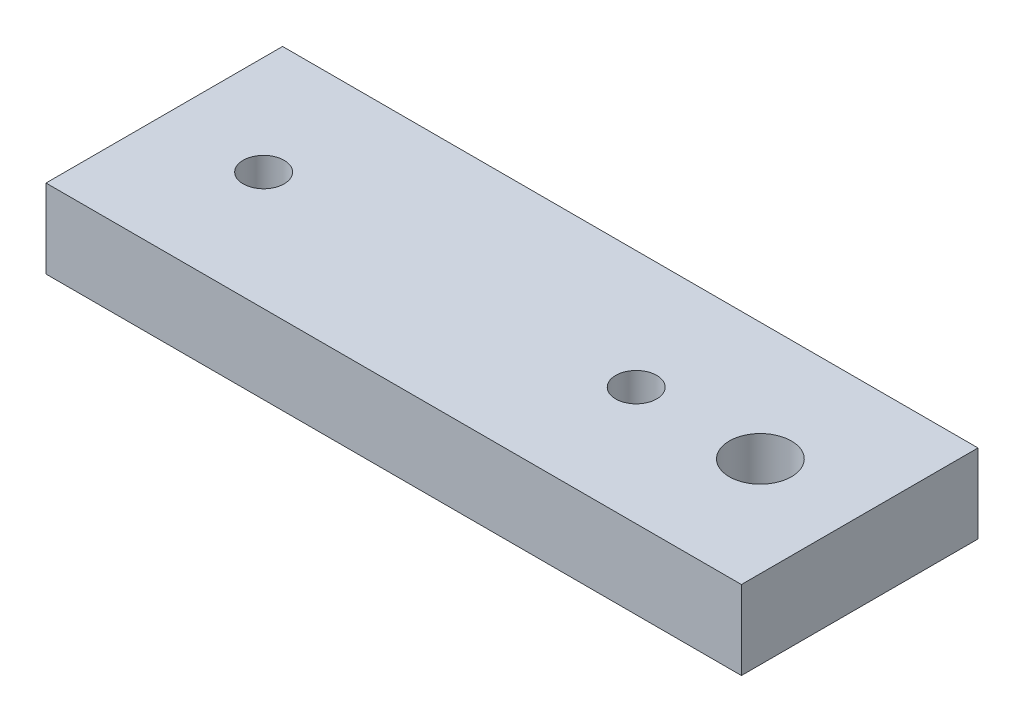
ISO-10303-21;
HEADER;
FILE_DESCRIPTION(('STEP AP214'),'2;1');
FILE_NAME('part.step','',(''),(''),'','','');
FILE_SCHEMA(('AUTOMOTIVE_DESIGN { 1 0 10303 214 1 1 1 1 }'));
ENDSEC;
DATA;
#1=APPLICATION_CONTEXT('core data for automotive mechanical design processes');
#2=APPLICATION_PROTOCOL_DEFINITION('international standard','automotive_design',2000,#1);
#3=PRODUCT_CONTEXT('',#1,'mechanical');
#4=PRODUCT('Part','Part','',(#3));
#5=PRODUCT_RELATED_PRODUCT_CATEGORY('part','',(#4));
#6=PRODUCT_DEFINITION_FORMATION('','',#4);
#7=PRODUCT_DEFINITION_CONTEXT('part definition',#1,'design');
#8=PRODUCT_DEFINITION('design','',#6,#7);
#9=PRODUCT_DEFINITION_SHAPE('','',#8);
#10=(LENGTH_UNIT() NAMED_UNIT(*) SI_UNIT(.MILLI.,.METRE.));
#11=(NAMED_UNIT(*) PLANE_ANGLE_UNIT() SI_UNIT($,.RADIAN.));
#12=(NAMED_UNIT(*) SI_UNIT($,.STERADIAN.) SOLID_ANGLE_UNIT());
#13=UNCERTAINTY_MEASURE_WITH_UNIT(LENGTH_MEASURE(1.E-05),#10,'distance_accuracy_value','');
#14=(GEOMETRIC_REPRESENTATION_CONTEXT(3) GLOBAL_UNCERTAINTY_ASSIGNED_CONTEXT((#13)) GLOBAL_UNIT_ASSIGNED_CONTEXT((#10,
#11,#12)) REPRESENTATION_CONTEXT('',''));
#15=CARTESIAN_POINT('',(0.,0.,0.));
#16=DIRECTION('',(0.,0.,1.));
#17=DIRECTION('',(1.,0.,0.));
#18=AXIS2_PLACEMENT_3D('',#15,#16,#17);
#19=CARTESIAN_POINT('',(-28.,6.35,9.525));
#20=DIRECTION('',(1.,0.,0.));
#21=DIRECTION('',(0.,0.,-1.));
#22=AXIS2_PLACEMENT_3D('',#19,#20,#21);
#23=PLANE('',#22);
#24=DIRECTION('',(0.,0.,1.));
#25=VECTOR('',#24,1.);
#26=CARTESIAN_POINT('',(-28.,0.,9.525));
#27=LINE('',#26,#25);
#28=CARTESIAN_POINT('',(-28.,0.,-9.525));
#29=VERTEX_POINT('',#28);
#30=CARTESIAN_POINT('',(-28.,0.,9.525));
#31=VERTEX_POINT('',#30);
#32=EDGE_CURVE('E98',#29,#31,#27,.T.);
#33=ORIENTED_EDGE('',*,*,#32,.T.);
#34=DIRECTION('',(0.,-1.,0.));
#35=VECTOR('',#34,1.);
#36=CARTESIAN_POINT('',(-28.,6.35,9.525));
#37=LINE('',#36,#35);
#38=CARTESIAN_POINT('',(-28.,6.35,9.525));
#39=VERTEX_POINT('',#38);
#40=EDGE_CURVE('E11',#39,#31,#37,.T.);
#41=ORIENTED_EDGE('',*,*,#40,.F.);
#42=DIRECTION('',(0.,0.,1.));
#43=VECTOR('',#42,1.);
#44=CARTESIAN_POINT('',(-28.,6.35,9.525));
#45=LINE('',#44,#43);
#46=CARTESIAN_POINT('',(-28.,6.35,-9.525));
#47=VERTEX_POINT('',#46);
#48=EDGE_CURVE('E86',#47,#39,#45,.T.);
#49=ORIENTED_EDGE('',*,*,#48,.F.);
#50=DIRECTION('',(0.,-1.,0.));
#51=VECTOR('',#50,1.);
#52=CARTESIAN_POINT('',(-28.,6.35,-9.525));
#53=LINE('',#52,#51);
#54=EDGE_CURVE('E94',#47,#29,#53,.T.);
#55=ORIENTED_EDGE('',*,*,#54,.T.);
#56=EDGE_LOOP('',(#33,#41,#49,#55));
#57=FACE_BOUND('',#56,.T.);
#58=ADVANCED_FACE('F35',(#57),#23,.F.);
#59=CARTESIAN_POINT('',(28.,6.35,9.525));
#60=DIRECTION('',(0.,0.,-1.));
#61=DIRECTION('',(-1.,0.,0.));
#62=AXIS2_PLACEMENT_3D('',#59,#60,#61);
#63=PLANE('',#62);
#64=DIRECTION('',(1.,0.,0.));
#65=VECTOR('',#64,1.);
#66=CARTESIAN_POINT('',(28.,0.,9.525));
#67=LINE('',#66,#65);
#68=CARTESIAN_POINT('',(28.,0.,9.525));
#69=VERTEX_POINT('',#68);
#70=EDGE_CURVE('E90',#31,#69,#67,.T.);
#71=ORIENTED_EDGE('',*,*,#70,.T.);
#72=DIRECTION('',(0.,-1.,0.));
#73=VECTOR('',#72,1.);
#74=CARTESIAN_POINT('',(28.,6.35,9.525));
#75=LINE('',#74,#73);
#76=CARTESIAN_POINT('',(28.,6.35,9.525));
#77=VERTEX_POINT('',#76);
#78=EDGE_CURVE('E43',#77,#69,#75,.T.);
#79=ORIENTED_EDGE('',*,*,#78,.F.);
#80=DIRECTION('',(1.,0.,0.));
#81=VECTOR('',#80,1.);
#82=CARTESIAN_POINT('',(28.,6.35,9.525));
#83=LINE('',#82,#81);
#84=EDGE_CURVE('E81',#39,#77,#83,.T.);
#85=ORIENTED_EDGE('',*,*,#84,.F.);
#86=ORIENTED_EDGE('',*,*,#40,.T.);
#87=EDGE_LOOP('',(#71,#79,#85,#86));
#88=FACE_BOUND('',#87,.T.);
#89=ADVANCED_FACE('F89',(#88),#63,.F.);
#90=CARTESIAN_POINT('',(28.,6.35,9.525));
#91=DIRECTION('',(-1.,0.,0.));
#92=DIRECTION('',(0.,0.,1.));
#93=AXIS2_PLACEMENT_3D('',#90,#91,#92);
#94=PLANE('',#93);
#95=DIRECTION('',(0.,0.,-1.));
#96=VECTOR('',#95,1.);
#97=CARTESIAN_POINT('',(28.,0.,9.525));
#98=LINE('',#97,#96);
#99=CARTESIAN_POINT('',(28.,0.,-9.52500000000001));
#100=VERTEX_POINT('',#99);
#101=EDGE_CURVE('E68',#69,#100,#98,.T.);
#102=ORIENTED_EDGE('',*,*,#101,.T.);
#103=DIRECTION('',(0.,-1.,0.));
#104=VECTOR('',#103,1.);
#105=CARTESIAN_POINT('',(28.,6.35,-9.52500000000001));
#106=LINE('',#105,#104);
#107=CARTESIAN_POINT('',(28.,6.35,-9.52500000000001));
#108=VERTEX_POINT('',#107);
#109=EDGE_CURVE('E91',#108,#100,#106,.T.);
#110=ORIENTED_EDGE('',*,*,#109,.F.);
#111=DIRECTION('',(0.,0.,-1.));
#112=VECTOR('',#111,1.);
#113=CARTESIAN_POINT('',(28.,6.35,9.525));
#114=LINE('',#113,#112);
#115=EDGE_CURVE('E84',#77,#108,#114,.T.);
#116=ORIENTED_EDGE('',*,*,#115,.F.);
#117=ORIENTED_EDGE('',*,*,#78,.T.);
#118=EDGE_LOOP('',(#102,#110,#116,#117));
#119=FACE_BOUND('',#118,.T.);
#120=ADVANCED_FACE('F92',(#119),#94,.F.);
#121=CARTESIAN_POINT('',(28.,6.35,-9.52500000000001));
#122=DIRECTION('',(0.,0.,1.));
#123=DIRECTION('',(1.,0.,0.));
#124=AXIS2_PLACEMENT_3D('',#121,#122,#123);
#125=PLANE('',#124);
#126=DIRECTION('',(-1.,0.,0.));
#127=VECTOR('',#126,1.);
#128=CARTESIAN_POINT('',(28.,0.,-9.52500000000001));
#129=LINE('',#128,#127);
#130=EDGE_CURVE('E74',#100,#29,#129,.T.);
#131=ORIENTED_EDGE('',*,*,#130,.T.);
#132=ORIENTED_EDGE('',*,*,#54,.F.);
#133=DIRECTION('',(-1.,0.,0.));
#134=VECTOR('',#133,1.);
#135=CARTESIAN_POINT('',(28.,6.35,-9.52500000000001));
#136=LINE('',#135,#134);
#137=EDGE_CURVE('E51',#108,#47,#136,.T.);
#138=ORIENTED_EDGE('',*,*,#137,.F.);
#139=ORIENTED_EDGE('',*,*,#109,.T.);
#140=EDGE_LOOP('',(#131,#132,#138,#139));
#141=FACE_BOUND('',#140,.T.);
#142=ADVANCED_FACE('F106',(#141),#125,.F.);
#143=CARTESIAN_POINT('',(0.,6.35,0.));
#144=DIRECTION('',(0.,1.,0.));
#145=DIRECTION('',(0.,0.,1.));
#146=AXIS2_PLACEMENT_3D('',#143,#144,#145);
#147=PLANE('',#146);
#148=CARTESIAN_POINT('',(-20.,6.35,0.));
#149=DIRECTION('',(0.,1.,0.));
#150=DIRECTION('',(0.,0.,1.));
#151=AXIS2_PLACEMENT_3D('',#148,#149,#150);
#152=CIRCLE('',#151,1.65);
#153=CARTESIAN_POINT('',(-20.,6.35,1.65));
#154=VERTEX_POINT('',#153);
#155=EDGE_CURVE('E126',#154,#154,#152,.T.);
#156=ORIENTED_EDGE('',*,*,#155,.F.);
#157=EDGE_LOOP('',(#156));
#158=FACE_BOUND('',#157,.T.);
#159=CARTESIAN_POINT('',(10.,6.35,0.));
#160=DIRECTION('',(0.,1.,0.));
#161=DIRECTION('',(0.,0.,1.));
#162=AXIS2_PLACEMENT_3D('',#159,#160,#161);
#163=CIRCLE('',#162,1.65);
#164=CARTESIAN_POINT('',(10.,6.35,1.65));
#165=VERTEX_POINT('',#164);
#166=EDGE_CURVE('E120',#165,#165,#163,.T.);
#167=ORIENTED_EDGE('',*,*,#166,.F.);
#168=EDGE_LOOP('',(#167));
#169=FACE_BOUND('',#168,.T.);
#170=CARTESIAN_POINT('',(20.,6.35,0.));
#171=DIRECTION('',(0.,1.,0.));
#172=DIRECTION('',(0.,0.,1.));
#173=AXIS2_PLACEMENT_3D('',#170,#171,#172);
#174=CIRCLE('',#173,2.5);
#175=CARTESIAN_POINT('',(20.,6.35,2.5));
#176=VERTEX_POINT('',#175);
#177=EDGE_CURVE('E114',#176,#176,#174,.T.);
#178=ORIENTED_EDGE('',*,*,#177,.F.);
#179=EDGE_LOOP('',(#178));
#180=FACE_BOUND('',#179,.T.);
#181=ORIENTED_EDGE('',*,*,#48,.T.);
#182=ORIENTED_EDGE('',*,*,#84,.T.);
#183=ORIENTED_EDGE('',*,*,#115,.T.);
#184=ORIENTED_EDGE('',*,*,#137,.T.);
#185=EDGE_LOOP('',(#181,#182,#183,#184));
#186=FACE_BOUND('',#185,.T.);
#187=ADVANCED_FACE('F82',(#158,#169,#180,#186),#147,.T.);
#188=CARTESIAN_POINT('',(0.,0.,0.));
#189=DIRECTION('',(0.,1.,0.));
#190=DIRECTION('',(0.,0.,1.));
#191=AXIS2_PLACEMENT_3D('',#188,#189,#190);
#192=PLANE('',#191);
#193=CARTESIAN_POINT('',(-20.,0.,0.));
#194=DIRECTION('',(0.,1.,0.));
#195=DIRECTION('',(0.,0.,1.));
#196=AXIS2_PLACEMENT_3D('',#193,#194,#195);
#197=CIRCLE('',#196,1.65);
#198=CARTESIAN_POINT('',(-20.,0.,1.65));
#199=VERTEX_POINT('',#198);
#200=EDGE_CURVE('E123',#199,#199,#197,.T.);
#201=ORIENTED_EDGE('',*,*,#200,.T.);
#202=EDGE_LOOP('',(#201));
#203=FACE_BOUND('',#202,.T.);
#204=CARTESIAN_POINT('',(10.,0.,0.));
#205=DIRECTION('',(0.,1.,0.));
#206=DIRECTION('',(0.,0.,1.));
#207=AXIS2_PLACEMENT_3D('',#204,#205,#206);
#208=CIRCLE('',#207,1.65);
#209=CARTESIAN_POINT('',(10.,0.,1.65));
#210=VERTEX_POINT('',#209);
#211=EDGE_CURVE('E117',#210,#210,#208,.T.);
#212=ORIENTED_EDGE('',*,*,#211,.T.);
#213=EDGE_LOOP('',(#212));
#214=FACE_BOUND('',#213,.T.);
#215=CARTESIAN_POINT('',(20.,0.,0.));
#216=DIRECTION('',(0.,1.,0.));
#217=DIRECTION('',(0.,0.,1.));
#218=AXIS2_PLACEMENT_3D('',#215,#216,#217);
#219=CIRCLE('',#218,2.5);
#220=CARTESIAN_POINT('',(20.,0.,2.5));
#221=VERTEX_POINT('',#220);
#222=EDGE_CURVE('E101',#221,#221,#219,.T.);
#223=ORIENTED_EDGE('',*,*,#222,.T.);
#224=EDGE_LOOP('',(#223));
#225=FACE_BOUND('',#224,.T.);
#226=ORIENTED_EDGE('',*,*,#32,.F.);
#227=ORIENTED_EDGE('',*,*,#130,.F.);
#228=ORIENTED_EDGE('',*,*,#101,.F.);
#229=ORIENTED_EDGE('',*,*,#70,.F.);
#230=EDGE_LOOP('',(#226,#227,#228,#229));
#231=FACE_BOUND('',#230,.T.);
#232=ADVANCED_FACE('F109',(#203,#214,#225,#231),#192,.F.);
#233=CARTESIAN_POINT('',(20.,6.35,0.));
#234=DIRECTION('',(0.,1.,0.));
#235=DIRECTION('',(0.,0.,1.));
#236=AXIS2_PLACEMENT_3D('',#233,#234,#235);
#237=CYLINDRICAL_SURFACE('',#236,2.5);
#238=ORIENTED_EDGE('',*,*,#222,.F.);
#239=EDGE_LOOP('',(#238));
#240=FACE_BOUND('',#239,.T.);
#241=ORIENTED_EDGE('',*,*,#177,.T.);
#242=EDGE_LOOP('',(#241));
#243=FACE_BOUND('',#242,.T.);
#244=ADVANCED_FACE('F139',(#240,#243),#237,.F.);
#245=CARTESIAN_POINT('',(10.,6.35,0.));
#246=DIRECTION('',(0.,1.,0.));
#247=DIRECTION('',(0.,0.,1.));
#248=AXIS2_PLACEMENT_3D('',#245,#246,#247);
#249=CYLINDRICAL_SURFACE('',#248,1.65);
#250=ORIENTED_EDGE('',*,*,#211,.F.);
#251=EDGE_LOOP('',(#250));
#252=FACE_BOUND('',#251,.T.);
#253=ORIENTED_EDGE('',*,*,#166,.T.);
#254=EDGE_LOOP('',(#253));
#255=FACE_BOUND('',#254,.T.);
#256=ADVANCED_FACE('F141',(#252,#255),#249,.F.);
#257=CARTESIAN_POINT('',(-20.,6.35,0.));
#258=DIRECTION('',(0.,1.,0.));
#259=DIRECTION('',(0.,0.,1.));
#260=AXIS2_PLACEMENT_3D('',#257,#258,#259);
#261=CYLINDRICAL_SURFACE('',#260,1.65);
#262=ORIENTED_EDGE('',*,*,#200,.F.);
#263=EDGE_LOOP('',(#262));
#264=FACE_BOUND('',#263,.T.);
#265=ORIENTED_EDGE('',*,*,#155,.T.);
#266=EDGE_LOOP('',(#265));
#267=FACE_BOUND('',#266,.T.);
#268=ADVANCED_FACE('F130',(#264,#267),#261,.F.);
#269=CLOSED_SHELL('',(#58,#89,#120,#142,#187,#232,#244,#256,#268));
#270=MANIFOLD_SOLID_BREP('B2',#269);
#271=ADVANCED_BREP_SHAPE_REPRESENTATION('',(#18,#270),#14);
#272=SHAPE_DEFINITION_REPRESENTATION(#9,#271);
ENDSEC;
END-ISO-10303-21;
